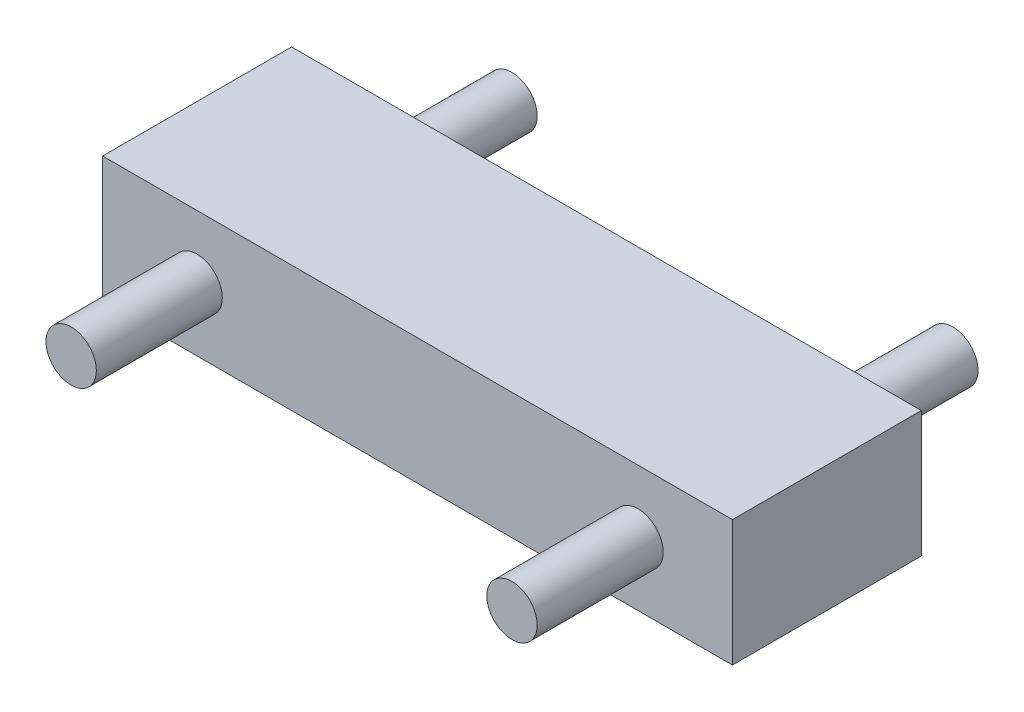
ISO-10303-21;
HEADER;
FILE_DESCRIPTION(('STEP AP214'),'2;1');
FILE_NAME('part.step','',(''),(''),'','','');
FILE_SCHEMA(('AUTOMOTIVE_DESIGN { 1 0 10303 214 1 1 1 1 }'));
ENDSEC;
DATA;
#1=APPLICATION_CONTEXT('core data for automotive mechanical design processes');
#2=APPLICATION_PROTOCOL_DEFINITION('international standard','automotive_design',2000,#1);
#3=PRODUCT_CONTEXT('',#1,'mechanical');
#4=PRODUCT('Part','Part','',(#3));
#5=PRODUCT_RELATED_PRODUCT_CATEGORY('part','',(#4));
#6=PRODUCT_DEFINITION_FORMATION('','',#4);
#7=PRODUCT_DEFINITION_CONTEXT('part definition',#1,'design');
#8=PRODUCT_DEFINITION('design','',#6,#7);
#9=PRODUCT_DEFINITION_SHAPE('','',#8);
#10=(LENGTH_UNIT() NAMED_UNIT(*) SI_UNIT(.MILLI.,.METRE.));
#11=(NAMED_UNIT(*) PLANE_ANGLE_UNIT() SI_UNIT($,.RADIAN.));
#12=(NAMED_UNIT(*) SI_UNIT($,.STERADIAN.) SOLID_ANGLE_UNIT());
#13=UNCERTAINTY_MEASURE_WITH_UNIT(LENGTH_MEASURE(1.E-05),#10,'distance_accuracy_value','');
#14=(GEOMETRIC_REPRESENTATION_CONTEXT(3) GLOBAL_UNCERTAINTY_ASSIGNED_CONTEXT((#13)) GLOBAL_UNIT_ASSIGNED_CONTEXT((#10,
#11,#12)) REPRESENTATION_CONTEXT('',''));
#15=CARTESIAN_POINT('',(0.,0.,0.));
#16=DIRECTION('',(0.,0.,1.));
#17=DIRECTION('',(1.,0.,0.));
#18=AXIS2_PLACEMENT_3D('',#15,#16,#17);
#19=CARTESIAN_POINT('',(500.,-200.,150.));
#20=DIRECTION('',(1.,0.,0.));
#21=DIRECTION('',(0.,0.,-1.));
#22=AXIS2_PLACEMENT_3D('',#19,#20,#21);
#23=PLANE('',#22);
#24=DIRECTION('',(0.,0.,-1.));
#25=VECTOR('',#24,1.);
#26=CARTESIAN_POINT('',(500.,0.,150.));
#27=LINE('',#26,#25);
#28=CARTESIAN_POINT('',(500.,0.,150.));
#29=VERTEX_POINT('',#28);
#30=CARTESIAN_POINT('',(500.,0.,-150.));
#31=VERTEX_POINT('',#30);
#32=EDGE_CURVE('E106',#29,#31,#27,.T.);
#33=ORIENTED_EDGE('',*,*,#32,.F.);
#34=DIRECTION('',(0.,1.,0.));
#35=VECTOR('',#34,1.);
#36=CARTESIAN_POINT('',(500.,-200.,150.));
#37=LINE('',#36,#35);
#38=CARTESIAN_POINT('',(500.,-200.,150.));
#39=VERTEX_POINT('',#38);
#40=EDGE_CURVE('E11',#39,#29,#37,.T.);
#41=ORIENTED_EDGE('',*,*,#40,.F.);
#42=DIRECTION('',(0.,0.,-1.));
#43=VECTOR('',#42,1.);
#44=CARTESIAN_POINT('',(500.,-200.,150.));
#45=LINE('',#44,#43);
#46=CARTESIAN_POINT('',(500.,-200.,-150.));
#47=VERTEX_POINT('',#46);
#48=EDGE_CURVE('E99',#39,#47,#45,.T.);
#49=ORIENTED_EDGE('',*,*,#48,.T.);
#50=DIRECTION('',(0.,1.,0.));
#51=VECTOR('',#50,1.);
#52=CARTESIAN_POINT('',(500.,-200.,-150.));
#53=LINE('',#52,#51);
#54=EDGE_CURVE('E44',#47,#31,#53,.T.);
#55=ORIENTED_EDGE('',*,*,#54,.T.);
#56=EDGE_LOOP('',(#33,#41,#49,#55));
#57=FACE_BOUND('',#56,.T.);
#58=ADVANCED_FACE('F41',(#57),#23,.T.);
#59=CARTESIAN_POINT('',(-500.,-200.,150.));
#60=DIRECTION('',(0.,0.,1.));
#61=DIRECTION('',(1.,0.,0.));
#62=AXIS2_PLACEMENT_3D('',#59,#60,#61);
#63=PLANE('',#62);
#64=CARTESIAN_POINT('',(350.,-100.,150.));
#65=DIRECTION('',(0.,0.,1.));
#66=DIRECTION('',(1.,0.,0.));
#67=AXIS2_PLACEMENT_3D('',#64,#65,#66);
#68=CIRCLE('',#67,40.);
#69=CARTESIAN_POINT('',(390.,-100.,150.));
#70=VERTEX_POINT('',#69);
#71=EDGE_CURVE('E156',#70,#70,#68,.T.);
#72=ORIENTED_EDGE('',*,*,#71,.F.);
#73=EDGE_LOOP('',(#72));
#74=FACE_BOUND('',#73,.T.);
#75=CARTESIAN_POINT('',(-350.,-100.,150.));
#76=DIRECTION('',(0.,0.,1.));
#77=DIRECTION('',(1.,0.,0.));
#78=AXIS2_PLACEMENT_3D('',#75,#76,#77);
#79=CIRCLE('',#78,40.);
#80=CARTESIAN_POINT('',(-310.,-100.,150.));
#81=VERTEX_POINT('',#80);
#82=EDGE_CURVE('E159',#81,#81,#79,.T.);
#83=ORIENTED_EDGE('',*,*,#82,.F.);
#84=EDGE_LOOP('',(#83));
#85=FACE_BOUND('',#84,.T.);
#86=DIRECTION('',(1.,0.,0.));
#87=VECTOR('',#86,1.);
#88=CARTESIAN_POINT('',(-500.,0.,150.));
#89=LINE('',#88,#87);
#90=CARTESIAN_POINT('',(-500.,0.,150.));
#91=VERTEX_POINT('',#90);
#92=EDGE_CURVE('E101',#91,#29,#89,.T.);
#93=ORIENTED_EDGE('',*,*,#92,.F.);
#94=DIRECTION('',(0.,1.,0.));
#95=VECTOR('',#94,1.);
#96=CARTESIAN_POINT('',(-500.,-200.,150.));
#97=LINE('',#96,#95);
#98=CARTESIAN_POINT('',(-500.,-200.,150.));
#99=VERTEX_POINT('',#98);
#100=EDGE_CURVE('E50',#99,#91,#97,.T.);
#101=ORIENTED_EDGE('',*,*,#100,.F.);
#102=DIRECTION('',(1.,0.,0.));
#103=VECTOR('',#102,1.);
#104=CARTESIAN_POINT('',(-500.,-200.,150.));
#105=LINE('',#104,#103);
#106=EDGE_CURVE('E96',#99,#39,#105,.T.);
#107=ORIENTED_EDGE('',*,*,#106,.T.);
#108=ORIENTED_EDGE('',*,*,#40,.T.);
#109=EDGE_LOOP('',(#93,#101,#107,#108));
#110=FACE_BOUND('',#109,.T.);
#111=ADVANCED_FACE('F117',(#74,#85,#110),#63,.T.);
#112=CARTESIAN_POINT('',(-500.,-200.,150.));
#113=DIRECTION('',(-1.,0.,0.));
#114=DIRECTION('',(0.,0.,1.));
#115=AXIS2_PLACEMENT_3D('',#112,#113,#114);
#116=PLANE('',#115);
#117=DIRECTION('',(0.,0.,1.));
#118=VECTOR('',#117,1.);
#119=CARTESIAN_POINT('',(-500.,0.,150.));
#120=LINE('',#119,#118);
#121=CARTESIAN_POINT('',(-500.,0.,-150.));
#122=VERTEX_POINT('',#121);
#123=EDGE_CURVE('E91',#122,#91,#120,.T.);
#124=ORIENTED_EDGE('',*,*,#123,.F.);
#125=DIRECTION('',(0.,1.,0.));
#126=VECTOR('',#125,1.);
#127=CARTESIAN_POINT('',(-500.,-200.,-150.));
#128=LINE('',#127,#126);
#129=CARTESIAN_POINT('',(-500.,-200.,-150.));
#130=VERTEX_POINT('',#129);
#131=EDGE_CURVE('E86',#130,#122,#128,.T.);
#132=ORIENTED_EDGE('',*,*,#131,.F.);
#133=DIRECTION('',(0.,0.,1.));
#134=VECTOR('',#133,1.);
#135=CARTESIAN_POINT('',(-500.,-200.,150.));
#136=LINE('',#135,#134);
#137=EDGE_CURVE('E89',#130,#99,#136,.T.);
#138=ORIENTED_EDGE('',*,*,#137,.T.);
#139=ORIENTED_EDGE('',*,*,#100,.T.);
#140=EDGE_LOOP('',(#124,#132,#138,#139));
#141=FACE_BOUND('',#140,.T.);
#142=ADVANCED_FACE('F88',(#141),#116,.T.);
#143=CARTESIAN_POINT('',(-500.,-200.,-150.));
#144=DIRECTION('',(0.,0.,-1.));
#145=DIRECTION('',(-1.,0.,0.));
#146=AXIS2_PLACEMENT_3D('',#143,#144,#145);
#147=PLANE('',#146);
#148=CARTESIAN_POINT('',(-350.,-100.,-150.));
#149=DIRECTION('',(0.,0.,-1.));
#150=DIRECTION('',(-1.,0.,0.));
#151=AXIS2_PLACEMENT_3D('',#148,#149,#150);
#152=CIRCLE('',#151,40.);
#153=CARTESIAN_POINT('',(-390.,-100.,-150.));
#154=VERTEX_POINT('',#153);
#155=EDGE_CURVE('E142',#154,#154,#152,.T.);
#156=ORIENTED_EDGE('',*,*,#155,.F.);
#157=EDGE_LOOP('',(#156));
#158=FACE_BOUND('',#157,.T.);
#159=CARTESIAN_POINT('',(350.,-100.,-150.));
#160=DIRECTION('',(0.,0.,-1.));
#161=DIRECTION('',(-1.,0.,0.));
#162=AXIS2_PLACEMENT_3D('',#159,#160,#161);
#163=CIRCLE('',#162,40.);
#164=CARTESIAN_POINT('',(310.,-100.,-150.));
#165=VERTEX_POINT('',#164);
#166=EDGE_CURVE('E145',#165,#165,#163,.T.);
#167=ORIENTED_EDGE('',*,*,#166,.F.);
#168=EDGE_LOOP('',(#167));
#169=FACE_BOUND('',#168,.T.);
#170=DIRECTION('',(-1.,0.,0.));
#171=VECTOR('',#170,1.);
#172=CARTESIAN_POINT('',(-500.,0.,-150.));
#173=LINE('',#172,#171);
#174=EDGE_CURVE('E109',#31,#122,#173,.T.);
#175=ORIENTED_EDGE('',*,*,#174,.F.);
#176=ORIENTED_EDGE('',*,*,#54,.F.);
#177=DIRECTION('',(-1.,0.,0.));
#178=VECTOR('',#177,1.);
#179=CARTESIAN_POINT('',(-500.,-200.,-150.));
#180=LINE('',#179,#178);
#181=EDGE_CURVE('E95',#47,#130,#180,.T.);
#182=ORIENTED_EDGE('',*,*,#181,.T.);
#183=ORIENTED_EDGE('',*,*,#131,.T.);
#184=EDGE_LOOP('',(#175,#176,#182,#183));
#185=FACE_BOUND('',#184,.T.);
#186=ADVANCED_FACE('F98',(#158,#169,#185),#147,.T.);
#187=CARTESIAN_POINT('',(0.,-200.,0.));
#188=DIRECTION('',(0.,-1.,0.));
#189=DIRECTION('',(0.,0.,-1.));
#190=AXIS2_PLACEMENT_3D('',#187,#188,#189);
#191=PLANE('',#190);
#192=ORIENTED_EDGE('',*,*,#48,.F.);
#193=ORIENTED_EDGE('',*,*,#106,.F.);
#194=ORIENTED_EDGE('',*,*,#137,.F.);
#195=ORIENTED_EDGE('',*,*,#181,.F.);
#196=EDGE_LOOP('',(#192,#193,#194,#195));
#197=FACE_BOUND('',#196,.T.);
#198=ADVANCED_FACE('F94',(#197),#191,.T.);
#199=CARTESIAN_POINT('',(0.,0.,0.));
#200=DIRECTION('',(0.,-1.,0.));
#201=DIRECTION('',(0.,0.,-1.));
#202=AXIS2_PLACEMENT_3D('',#199,#200,#201);
#203=PLANE('',#202);
#204=ORIENTED_EDGE('',*,*,#32,.T.);
#205=ORIENTED_EDGE('',*,*,#174,.T.);
#206=ORIENTED_EDGE('',*,*,#123,.T.);
#207=ORIENTED_EDGE('',*,*,#92,.T.);
#208=EDGE_LOOP('',(#204,#205,#206,#207));
#209=FACE_BOUND('',#208,.T.);
#210=ADVANCED_FACE('F116',(#209),#203,.F.);
#211=CARTESIAN_POINT('',(-350.,-100.,350.));
#212=DIRECTION('',(0.,0.,-1.));
#213=DIRECTION('',(-1.,0.,0.));
#214=AXIS2_PLACEMENT_3D('',#211,#212,#213);
#215=CYLINDRICAL_SURFACE('',#214,40.);
#216=CARTESIAN_POINT('',(-350.,-100.,350.));
#217=DIRECTION('',(0.,0.,1.));
#218=DIRECTION('',(1.,0.,0.));
#219=AXIS2_PLACEMENT_3D('',#216,#217,#218);
#220=CIRCLE('',#219,40.);
#221=CARTESIAN_POINT('',(-310.,-100.,350.));
#222=VERTEX_POINT('',#221);
#223=EDGE_CURVE('E110',#222,#222,#220,.T.);
#224=ORIENTED_EDGE('',*,*,#223,.F.);
#225=EDGE_LOOP('',(#224));
#226=FACE_BOUND('',#225,.T.);
#227=ORIENTED_EDGE('',*,*,#82,.T.);
#228=EDGE_LOOP('',(#227));
#229=FACE_BOUND('',#228,.T.);
#230=ADVANCED_FACE('F166',(#226,#229),#215,.T.);
#231=CARTESIAN_POINT('',(-350.,-100.,350.));
#232=DIRECTION('',(0.,0.,1.));
#233=DIRECTION('',(1.,0.,0.));
#234=AXIS2_PLACEMENT_3D('',#231,#232,#233);
#235=PLANE('',#234);
#236=ORIENTED_EDGE('',*,*,#223,.T.);
#237=EDGE_LOOP('',(#236));
#238=FACE_BOUND('',#237,.T.);
#239=ADVANCED_FACE('F167',(#238),#235,.T.);
#240=CARTESIAN_POINT('',(350.,-100.,350.));
#241=DIRECTION('',(0.,0.,-1.));
#242=DIRECTION('',(-1.,0.,0.));
#243=AXIS2_PLACEMENT_3D('',#240,#241,#242);
#244=CYLINDRICAL_SURFACE('',#243,40.);
#245=CARTESIAN_POINT('',(350.,-100.,350.));
#246=DIRECTION('',(0.,0.,1.));
#247=DIRECTION('',(1.,0.,0.));
#248=AXIS2_PLACEMENT_3D('',#245,#246,#247);
#249=CIRCLE('',#248,40.);
#250=CARTESIAN_POINT('',(390.,-100.,350.));
#251=VERTEX_POINT('',#250);
#252=EDGE_CURVE('E150',#251,#251,#249,.T.);
#253=ORIENTED_EDGE('',*,*,#252,.F.);
#254=EDGE_LOOP('',(#253));
#255=FACE_BOUND('',#254,.T.);
#256=ORIENTED_EDGE('',*,*,#71,.T.);
#257=EDGE_LOOP('',(#256));
#258=FACE_BOUND('',#257,.T.);
#259=ADVANCED_FACE('F173',(#255,#258),#244,.T.);
#260=CARTESIAN_POINT('',(350.,-100.,350.));
#261=DIRECTION('',(0.,0.,1.));
#262=DIRECTION('',(1.,0.,0.));
#263=AXIS2_PLACEMENT_3D('',#260,#261,#262);
#264=PLANE('',#263);
#265=ORIENTED_EDGE('',*,*,#252,.T.);
#266=EDGE_LOOP('',(#265));
#267=FACE_BOUND('',#266,.T.);
#268=ADVANCED_FACE('F178',(#267),#264,.T.);
#269=CARTESIAN_POINT('',(350.,-100.,-350.));
#270=DIRECTION('',(0.,0.,1.));
#271=DIRECTION('',(1.,0.,0.));
#272=AXIS2_PLACEMENT_3D('',#269,#270,#271);
#273=CYLINDRICAL_SURFACE('',#272,40.);
#274=CARTESIAN_POINT('',(350.,-100.,-350.));
#275=DIRECTION('',(0.,0.,-1.));
#276=DIRECTION('',(-1.,0.,0.));
#277=AXIS2_PLACEMENT_3D('',#274,#275,#276);
#278=CIRCLE('',#277,40.);
#279=CARTESIAN_POINT('',(310.,-100.,-350.));
#280=VERTEX_POINT('',#279);
#281=EDGE_CURVE('E147',#280,#280,#278,.T.);
#282=ORIENTED_EDGE('',*,*,#281,.F.);
#283=EDGE_LOOP('',(#282));
#284=FACE_BOUND('',#283,.T.);
#285=ORIENTED_EDGE('',*,*,#166,.T.);
#286=EDGE_LOOP('',(#285));
#287=FACE_BOUND('',#286,.T.);
#288=ADVANCED_FACE('F180',(#284,#287),#273,.T.);
#289=CARTESIAN_POINT('',(350.,-100.,-350.));
#290=DIRECTION('',(0.,0.,-1.));
#291=DIRECTION('',(-1.,0.,0.));
#292=AXIS2_PLACEMENT_3D('',#289,#290,#291);
#293=PLANE('',#292);
#294=ORIENTED_EDGE('',*,*,#281,.T.);
#295=EDGE_LOOP('',(#294));
#296=FACE_BOUND('',#295,.T.);
#297=ADVANCED_FACE('F186',(#296),#293,.T.);
#298=CARTESIAN_POINT('',(-350.,-100.,-350.));
#299=DIRECTION('',(0.,0.,1.));
#300=DIRECTION('',(1.,0.,0.));
#301=AXIS2_PLACEMENT_3D('',#298,#299,#300);
#302=CYLINDRICAL_SURFACE('',#301,40.);
#303=CARTESIAN_POINT('',(-350.,-100.,-350.));
#304=DIRECTION('',(0.,0.,-1.));
#305=DIRECTION('',(-1.,0.,0.));
#306=AXIS2_PLACEMENT_3D('',#303,#304,#305);
#307=CIRCLE('',#306,40.);
#308=CARTESIAN_POINT('',(-390.,-100.,-350.));
#309=VERTEX_POINT('',#308);
#310=EDGE_CURVE('E152',#309,#309,#307,.T.);
#311=ORIENTED_EDGE('',*,*,#310,.F.);
#312=EDGE_LOOP('',(#311));
#313=FACE_BOUND('',#312,.T.);
#314=ORIENTED_EDGE('',*,*,#155,.T.);
#315=EDGE_LOOP('',(#314));
#316=FACE_BOUND('',#315,.T.);
#317=ADVANCED_FACE('F190',(#313,#316),#302,.T.);
#318=CARTESIAN_POINT('',(-350.,-100.,-350.));
#319=DIRECTION('',(0.,0.,-1.));
#320=DIRECTION('',(-1.,0.,0.));
#321=AXIS2_PLACEMENT_3D('',#318,#319,#320);
#322=PLANE('',#321);
#323=ORIENTED_EDGE('',*,*,#310,.T.);
#324=EDGE_LOOP('',(#323));
#325=FACE_BOUND('',#324,.T.);
#326=ADVANCED_FACE('F192',(#325),#322,.T.);
#327=CLOSED_SHELL('',(#58,#111,#142,#186,#198,#210,#230,#239,#259,#268,#288,#297,#317,#326));
#328=MANIFOLD_SOLID_BREP('B2',#327);
#329=ADVANCED_BREP_SHAPE_REPRESENTATION('',(#18,#328),#14);
#330=SHAPE_DEFINITION_REPRESENTATION(#9,#329);
ENDSEC;
END-ISO-10303-21;
